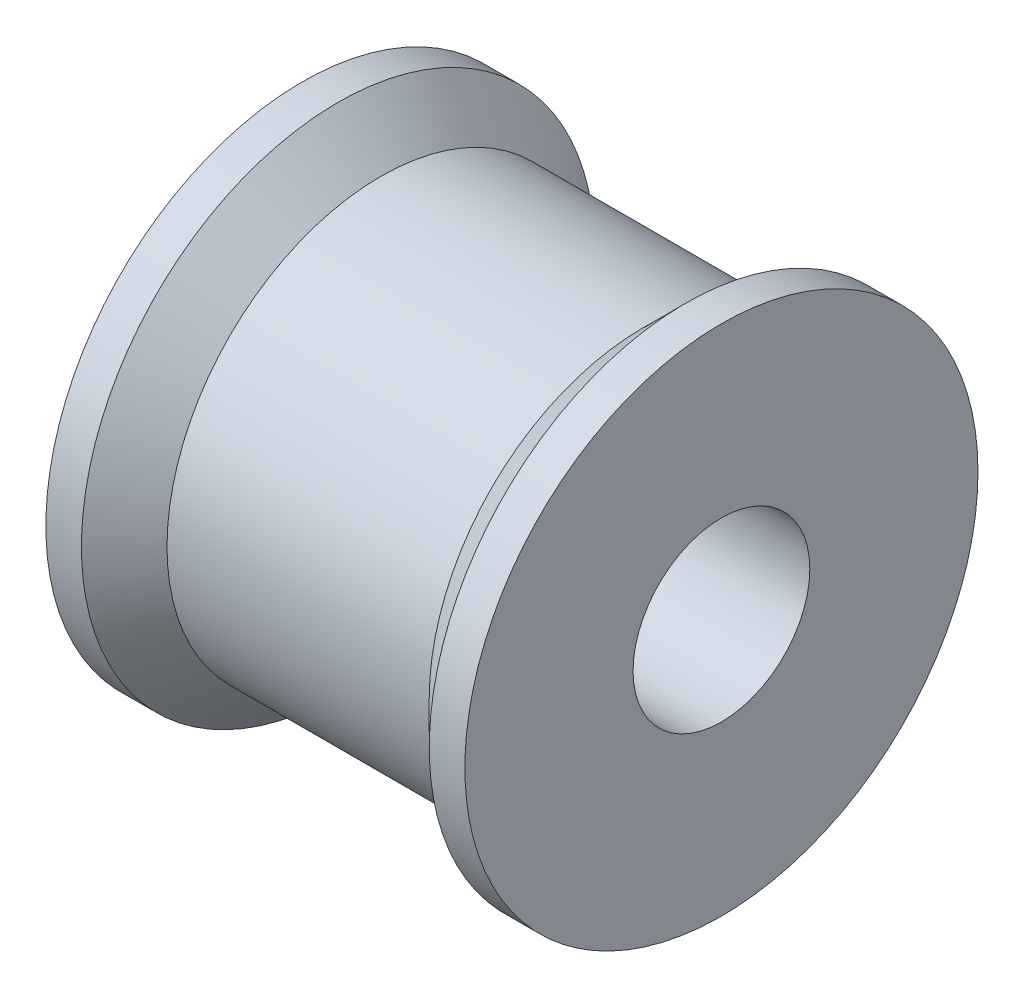
ISO-10303-21;
HEADER;
FILE_DESCRIPTION(('STEP AP214'),'2;1');
FILE_NAME('part.step','',(''),(''),'','','');
FILE_SCHEMA(('AUTOMOTIVE_DESIGN { 1 0 10303 214 1 1 1 1 }'));
ENDSEC;
DATA;
#1=APPLICATION_CONTEXT('core data for automotive mechanical design processes');
#2=APPLICATION_PROTOCOL_DEFINITION('international standard','automotive_design',2000,#1);
#3=PRODUCT_CONTEXT('',#1,'mechanical');
#4=PRODUCT('Part','Part','',(#3));
#5=PRODUCT_RELATED_PRODUCT_CATEGORY('part','',(#4));
#6=PRODUCT_DEFINITION_FORMATION('','',#4);
#7=PRODUCT_DEFINITION_CONTEXT('part definition',#1,'design');
#8=PRODUCT_DEFINITION('design','',#6,#7);
#9=PRODUCT_DEFINITION_SHAPE('','',#8);
#10=(LENGTH_UNIT() NAMED_UNIT(*) SI_UNIT(.MILLI.,.METRE.));
#11=(NAMED_UNIT(*) PLANE_ANGLE_UNIT() SI_UNIT($,.RADIAN.));
#12=(NAMED_UNIT(*) SI_UNIT($,.STERADIAN.) SOLID_ANGLE_UNIT());
#13=UNCERTAINTY_MEASURE_WITH_UNIT(LENGTH_MEASURE(1.E-05),#10,'distance_accuracy_value','');
#14=(GEOMETRIC_REPRESENTATION_CONTEXT(3) GLOBAL_UNCERTAINTY_ASSIGNED_CONTEXT((#13)) GLOBAL_UNIT_ASSIGNED_CONTEXT((#10,
#11,#12)) REPRESENTATION_CONTEXT('',''));
#15=CARTESIAN_POINT('',(0.,0.,0.));
#16=DIRECTION('',(0.,0.,1.));
#17=DIRECTION('',(1.,0.,0.));
#18=AXIS2_PLACEMENT_3D('',#15,#16,#17);
#19=CARTESIAN_POINT('',(-7.35,0.,-9.));
#20=DIRECTION('',(-1.,0.,0.));
#21=DIRECTION('',(0.,0.,1.));
#22=AXIS2_PLACEMENT_3D('',#19,#20,#21);
#23=PLANE('',#22);
#24=CARTESIAN_POINT('',(-7.35,0.,0.));
#25=DIRECTION('',(-1.,0.,0.));
#26=DIRECTION('',(0.,0.,1.));
#27=AXIS2_PLACEMENT_3D('',#24,#25,#26);
#28=CIRCLE('',#27,3.1);
#29=CARTESIAN_POINT('',(-7.35,0.,3.1));
#30=VERTEX_POINT('',#29);
#31=EDGE_CURVE('E72',#30,#30,#28,.T.);
#32=ORIENTED_EDGE('',*,*,#31,.F.);
#33=EDGE_LOOP('',(#32));
#34=FACE_BOUND('',#33,.T.);
#35=CARTESIAN_POINT('',(-7.35,0.,0.));
#36=DIRECTION('',(1.,0.,0.));
#37=DIRECTION('',(0.,0.,-1.));
#38=AXIS2_PLACEMENT_3D('',#35,#36,#37);
#39=CIRCLE('',#38,9.);
#40=CARTESIAN_POINT('',(-7.35,0.,-9.));
#41=VERTEX_POINT('',#40);
#42=EDGE_CURVE('E10',#41,#41,#39,.T.);
#43=ORIENTED_EDGE('',*,*,#42,.F.);
#44=EDGE_LOOP('',(#43));
#45=FACE_BOUND('',#44,.T.);
#46=ADVANCED_FACE('F37',(#34,#45),#23,.T.);
#47=CARTESIAN_POINT('',(7.35,0.,0.));
#48=DIRECTION('',(1.,0.,0.));
#49=DIRECTION('',(0.,0.,-1.));
#50=AXIS2_PLACEMENT_3D('',#47,#48,#49);
#51=CYLINDRICAL_SURFACE('',#50,9.);
#52=ORIENTED_EDGE('',*,*,#42,.T.);
#53=EDGE_LOOP('',(#52));
#54=FACE_BOUND('',#53,.T.);
#55=CARTESIAN_POINT('',(-6.1,0.,0.));
#56=DIRECTION('',(1.,0.,0.));
#57=DIRECTION('',(0.,0.,-1.));
#58=AXIS2_PLACEMENT_3D('',#55,#56,#57);
#59=CIRCLE('',#58,9.);
#60=CARTESIAN_POINT('',(-6.1,0.,-9.));
#61=VERTEX_POINT('',#60);
#62=EDGE_CURVE('E44',#61,#61,#59,.T.);
#63=ORIENTED_EDGE('',*,*,#62,.F.);
#64=EDGE_LOOP('',(#63));
#65=FACE_BOUND('',#64,.T.);
#66=ADVANCED_FACE('F82',(#54,#65),#51,.T.);
#67=CARTESIAN_POINT('',(-4.6,0.,0.));
#68=DIRECTION('',(-1.,0.,0.));
#69=DIRECTION('',(0.,0.,1.));
#70=AXIS2_PLACEMENT_3D('',#67,#68,#69);
#71=CONICAL_SURFACE('',#70,7.5,0.785398163397448);
#72=ORIENTED_EDGE('',*,*,#62,.T.);
#73=EDGE_LOOP('',(#72));
#74=FACE_BOUND('',#73,.T.);
#75=CARTESIAN_POINT('',(-4.6,0.,0.));
#76=DIRECTION('',(1.,0.,0.));
#77=DIRECTION('',(0.,0.,-1.));
#78=AXIS2_PLACEMENT_3D('',#75,#76,#77);
#79=CIRCLE('',#78,7.5);
#80=CARTESIAN_POINT('',(-4.6,0.,-7.5));
#81=VERTEX_POINT('',#80);
#82=EDGE_CURVE('E49',#81,#81,#79,.T.);
#83=ORIENTED_EDGE('',*,*,#82,.F.);
#84=EDGE_LOOP('',(#83));
#85=FACE_BOUND('',#84,.T.);
#86=ADVANCED_FACE('F86',(#74,#85),#71,.T.);
#87=CARTESIAN_POINT('',(7.35,0.,0.));
#88=DIRECTION('',(1.,0.,0.));
#89=DIRECTION('',(0.,0.,-1.));
#90=AXIS2_PLACEMENT_3D('',#87,#88,#89);
#91=CYLINDRICAL_SURFACE('',#90,7.5);
#92=ORIENTED_EDGE('',*,*,#82,.T.);
#93=EDGE_LOOP('',(#92));
#94=FACE_BOUND('',#93,.T.);
#95=CARTESIAN_POINT('',(4.6,0.,0.));
#96=DIRECTION('',(1.,0.,0.));
#97=DIRECTION('',(0.,0.,-1.));
#98=AXIS2_PLACEMENT_3D('',#95,#96,#97);
#99=CIRCLE('',#98,7.5);
#100=CARTESIAN_POINT('',(4.6,0.,-7.5));
#101=VERTEX_POINT('',#100);
#102=EDGE_CURVE('E54',#101,#101,#99,.T.);
#103=ORIENTED_EDGE('',*,*,#102,.F.);
#104=EDGE_LOOP('',(#103));
#105=FACE_BOUND('',#104,.T.);
#106=ADVANCED_FACE('F90',(#94,#105),#91,.T.);
#107=CARTESIAN_POINT('',(6.1,0.,0.));
#108=DIRECTION('',(1.,0.,0.));
#109=DIRECTION('',(0.,0.,-1.));
#110=AXIS2_PLACEMENT_3D('',#107,#108,#109);
#111=CONICAL_SURFACE('',#110,9.,0.785398163397448);
#112=ORIENTED_EDGE('',*,*,#102,.T.);
#113=EDGE_LOOP('',(#112));
#114=FACE_BOUND('',#113,.T.);
#115=CARTESIAN_POINT('',(6.1,0.,0.));
#116=DIRECTION('',(1.,0.,0.));
#117=DIRECTION('',(0.,0.,-1.));
#118=AXIS2_PLACEMENT_3D('',#115,#116,#117);
#119=CIRCLE('',#118,9.);
#120=CARTESIAN_POINT('',(6.1,0.,-9.));
#121=VERTEX_POINT('',#120);
#122=EDGE_CURVE('E60',#121,#121,#119,.T.);
#123=ORIENTED_EDGE('',*,*,#122,.F.);
#124=EDGE_LOOP('',(#123));
#125=FACE_BOUND('',#124,.T.);
#126=ADVANCED_FACE('F96',(#114,#125),#111,.T.);
#127=CARTESIAN_POINT('',(7.35,0.,0.));
#128=DIRECTION('',(1.,0.,0.));
#129=DIRECTION('',(0.,0.,-1.));
#130=AXIS2_PLACEMENT_3D('',#127,#128,#129);
#131=CYLINDRICAL_SURFACE('',#130,9.);
#132=ORIENTED_EDGE('',*,*,#122,.T.);
#133=EDGE_LOOP('',(#132));
#134=FACE_BOUND('',#133,.T.);
#135=CARTESIAN_POINT('',(7.35,0.,0.));
#136=DIRECTION('',(1.,0.,0.));
#137=DIRECTION('',(0.,0.,-1.));
#138=AXIS2_PLACEMENT_3D('',#135,#136,#137);
#139=CIRCLE('',#138,9.);
#140=CARTESIAN_POINT('',(7.35,0.,-9.));
#141=VERTEX_POINT('',#140);
#142=EDGE_CURVE('E64',#141,#141,#139,.T.);
#143=ORIENTED_EDGE('',*,*,#142,.F.);
#144=EDGE_LOOP('',(#143));
#145=FACE_BOUND('',#144,.T.);
#146=ADVANCED_FACE('F100',(#134,#145),#131,.T.);
#147=CARTESIAN_POINT('',(7.35,0.,-9.));
#148=DIRECTION('',(1.,0.,0.));
#149=DIRECTION('',(0.,0.,-1.));
#150=AXIS2_PLACEMENT_3D('',#147,#148,#149);
#151=PLANE('',#150);
#152=CARTESIAN_POINT('',(7.35,0.,0.));
#153=DIRECTION('',(1.,0.,0.));
#154=DIRECTION('',(0.,0.,-1.));
#155=AXIS2_PLACEMENT_3D('',#152,#153,#154);
#156=CIRCLE('',#155,3.1);
#157=CARTESIAN_POINT('',(7.35,0.,-3.1));
#158=VERTEX_POINT('',#157);
#159=EDGE_CURVE('E68',#158,#158,#156,.F.);
#160=ORIENTED_EDGE('',*,*,#159,.T.);
#161=EDGE_LOOP('',(#160));
#162=FACE_BOUND('',#161,.T.);
#163=ORIENTED_EDGE('',*,*,#142,.T.);
#164=EDGE_LOOP('',(#163));
#165=FACE_BOUND('',#164,.T.);
#166=ADVANCED_FACE('F104',(#162,#165),#151,.T.);
#167=CARTESIAN_POINT('',(16.1181240867132,0.,0.));
#168=DIRECTION('',(-1.,0.,0.));
#169=DIRECTION('',(0.,0.,1.));
#170=AXIS2_PLACEMENT_3D('',#167,#168,#169);
#171=CYLINDRICAL_SURFACE('',#170,3.1);
#172=ORIENTED_EDGE('',*,*,#31,.T.);
#173=EDGE_LOOP('',(#172));
#174=FACE_BOUND('',#173,.T.);
#175=ORIENTED_EDGE('',*,*,#159,.F.);
#176=EDGE_LOOP('',(#175));
#177=FACE_BOUND('',#176,.T.);
#178=ADVANCED_FACE('F77',(#174,#177),#171,.F.);
#179=CLOSED_SHELL('',(#46,#66,#86,#106,#126,#146,#166,#178));
#180=MANIFOLD_SOLID_BREP('B2',#179);
#181=ADVANCED_BREP_SHAPE_REPRESENTATION('',(#18,#180),#14);
#182=SHAPE_DEFINITION_REPRESENTATION(#9,#181);
ENDSEC;
END-ISO-10303-21;
